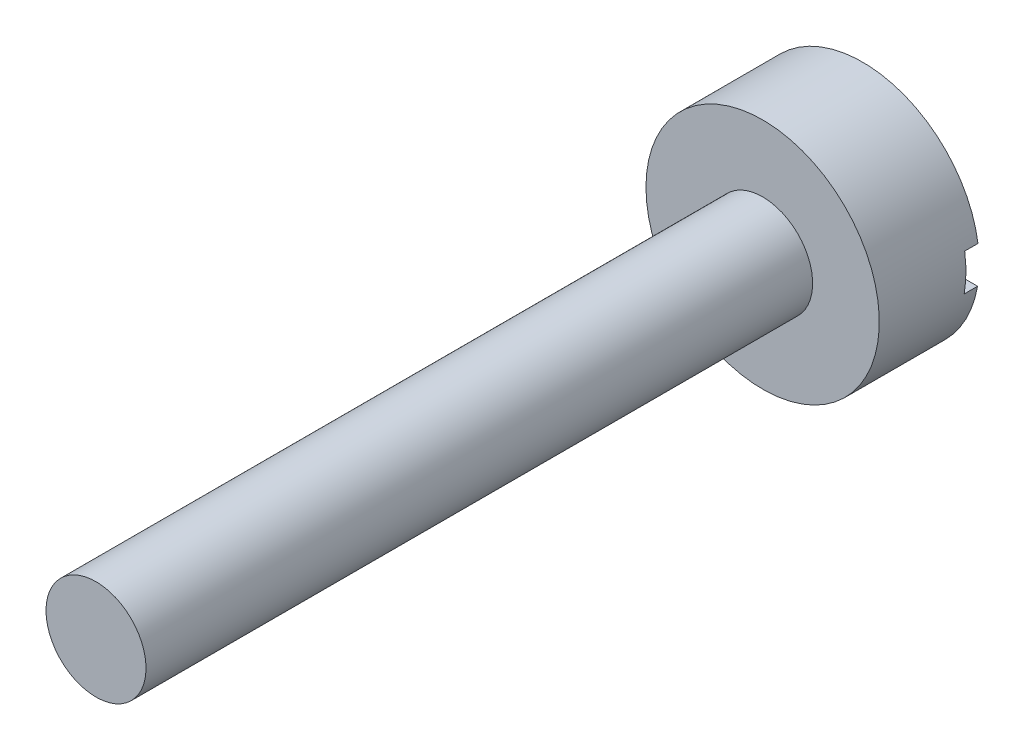
ISO-10303-21;
HEADER;
FILE_DESCRIPTION(('STEP AP214'),'2;1');
FILE_NAME('part.step','',(''),(''),'','','');
FILE_SCHEMA(('AUTOMOTIVE_DESIGN { 1 0 10303 214 1 1 1 1 }'));
ENDSEC;
DATA;
#1=APPLICATION_CONTEXT('core data for automotive mechanical design processes');
#2=APPLICATION_PROTOCOL_DEFINITION('international standard','automotive_design',2000,#1);
#3=PRODUCT_CONTEXT('',#1,'mechanical');
#4=PRODUCT('Part','Part','',(#3));
#5=PRODUCT_RELATED_PRODUCT_CATEGORY('part','',(#4));
#6=PRODUCT_DEFINITION_FORMATION('','',#4);
#7=PRODUCT_DEFINITION_CONTEXT('part definition',#1,'design');
#8=PRODUCT_DEFINITION('design','',#6,#7);
#9=PRODUCT_DEFINITION_SHAPE('','',#8);
#10=(LENGTH_UNIT() NAMED_UNIT(*) SI_UNIT(.MILLI.,.METRE.));
#11=(NAMED_UNIT(*) PLANE_ANGLE_UNIT() SI_UNIT($,.RADIAN.));
#12=(NAMED_UNIT(*) SI_UNIT($,.STERADIAN.) SOLID_ANGLE_UNIT());
#13=UNCERTAINTY_MEASURE_WITH_UNIT(LENGTH_MEASURE(1.E-05),#10,'distance_accuracy_value','');
#14=(GEOMETRIC_REPRESENTATION_CONTEXT(3) GLOBAL_UNCERTAINTY_ASSIGNED_CONTEXT((#13)) GLOBAL_UNIT_ASSIGNED_CONTEXT((#10,
#11,#12)) REPRESENTATION_CONTEXT('',''));
#15=CARTESIAN_POINT('',(0.,0.,0.));
#16=DIRECTION('',(0.,0.,1.));
#17=DIRECTION('',(1.,0.,0.));
#18=AXIS2_PLACEMENT_3D('',#15,#16,#17);
#19=CARTESIAN_POINT('',(4.445,0.,-29.21));
#20=DIRECTION('',(0.,0.,1.));
#21=DIRECTION('',(1.,0.,0.));
#22=AXIS2_PLACEMENT_3D('',#19,#20,#21);
#23=PLANE('',#22);
#24=CARTESIAN_POINT('',(0.,0.,-29.21));
#25=DIRECTION('',(0.,0.,-1.));
#26=DIRECTION('',(-1.,0.,0.));
#27=AXIS2_PLACEMENT_3D('',#24,#25,#26);
#28=CIRCLE('',#27,4.445);
#29=CARTESIAN_POINT('',(4.37919867098993,-0.762,-29.21));
#30=VERTEX_POINT('',#29);
#31=CARTESIAN_POINT('',(-4.37919867098993,-0.762,-29.21));
#32=VERTEX_POINT('',#31);
#33=EDGE_CURVE('E93',#30,#32,#28,.T.);
#34=ORIENTED_EDGE('',*,*,#33,.T.);
#35=DIRECTION('',(1.,0.,0.));
#36=VECTOR('',#35,1.);
#37=CARTESIAN_POINT('',(4.445,-0.762,-29.21));
#38=LINE('',#37,#36);
#39=EDGE_CURVE('E110',#32,#30,#38,.T.);
#40=ORIENTED_EDGE('',*,*,#39,.T.);
#41=EDGE_LOOP('',(#34,#40));
#42=FACE_BOUND('',#41,.T.);
#43=ADVANCED_FACE('F32',(#42),#23,.F.);
#44=CARTESIAN_POINT('',(0.,0.,0.));
#45=DIRECTION('',(0.,0.,-1.));
#46=DIRECTION('',(-1.,0.,0.));
#47=AXIS2_PLACEMENT_3D('',#44,#45,#46);
#48=PLANE('',#47);
#49=CARTESIAN_POINT('',(0.,0.,0.));
#50=DIRECTION('',(0.,0.,-1.));
#51=DIRECTION('',(-1.,0.,0.));
#52=AXIS2_PLACEMENT_3D('',#49,#50,#51);
#53=CIRCLE('',#52,1.905);
#54=CARTESIAN_POINT('',(-1.905,0.,0.));
#55=VERTEX_POINT('',#54);
#56=EDGE_CURVE('E107',#55,#55,#53,.T.);
#57=ORIENTED_EDGE('',*,*,#56,.F.);
#58=EDGE_LOOP('',(#57));
#59=FACE_BOUND('',#58,.T.);
#60=ADVANCED_FACE('F34',(#59),#48,.F.);
#61=CARTESIAN_POINT('',(0.,0.,-29.21));
#62=DIRECTION('',(0.,0.,-1.));
#63=DIRECTION('',(-1.,0.,0.));
#64=AXIS2_PLACEMENT_3D('',#61,#62,#63);
#65=CYLINDRICAL_SURFACE('',#64,1.905);
#66=CARTESIAN_POINT('',(0.,0.,-25.4));
#67=DIRECTION('',(0.,0.,-1.));
#68=DIRECTION('',(-1.,0.,0.));
#69=AXIS2_PLACEMENT_3D('',#66,#67,#68);
#70=CIRCLE('',#69,1.905);
#71=CARTESIAN_POINT('',(-1.905,0.,-25.4));
#72=VERTEX_POINT('',#71);
#73=EDGE_CURVE('E104',#72,#72,#70,.T.);
#74=ORIENTED_EDGE('',*,*,#73,.F.);
#75=EDGE_LOOP('',(#74));
#76=FACE_BOUND('',#75,.T.);
#77=ORIENTED_EDGE('',*,*,#56,.T.);
#78=EDGE_LOOP('',(#77));
#79=FACE_BOUND('',#78,.T.);
#80=ADVANCED_FACE('F128',(#76,#79),#65,.T.);
#81=CARTESIAN_POINT('',(1.905,0.,-25.4));
#82=DIRECTION('',(0.,0.,-1.));
#83=DIRECTION('',(-1.,0.,0.));
#84=AXIS2_PLACEMENT_3D('',#81,#82,#83);
#85=PLANE('',#84);
#86=CARTESIAN_POINT('',(0.,0.,-25.4));
#87=DIRECTION('',(0.,0.,-1.));
#88=DIRECTION('',(-1.,0.,0.));
#89=AXIS2_PLACEMENT_3D('',#86,#87,#88);
#90=CIRCLE('',#89,4.445);
#91=CARTESIAN_POINT('',(-4.445,0.,-25.4));
#92=VERTEX_POINT('',#91);
#93=EDGE_CURVE('E101',#92,#92,#90,.T.);
#94=ORIENTED_EDGE('',*,*,#93,.F.);
#95=EDGE_LOOP('',(#94));
#96=FACE_BOUND('',#95,.T.);
#97=ORIENTED_EDGE('',*,*,#73,.T.);
#98=EDGE_LOOP('',(#97));
#99=FACE_BOUND('',#98,.T.);
#100=ADVANCED_FACE('F136',(#96,#99),#85,.F.);
#101=CARTESIAN_POINT('',(0.,0.,-29.21));
#102=DIRECTION('',(0.,0.,-1.));
#103=DIRECTION('',(-1.,0.,0.));
#104=AXIS2_PLACEMENT_3D('',#101,#102,#103);
#105=CYLINDRICAL_SURFACE('',#104,4.445);
#106=ORIENTED_EDGE('',*,*,#33,.F.);
#107=DIRECTION('',(0.,0.,-1.));
#108=VECTOR('',#107,1.);
#109=CARTESIAN_POINT('',(4.37919867098993,-0.762,-29.21));
#110=LINE('',#109,#108);
#111=CARTESIAN_POINT('',(4.37919867098993,-0.762,-28.702));
#112=VERTEX_POINT('',#111);
#113=EDGE_CURVE('E81',#30,#112,#110,.F.);
#114=ORIENTED_EDGE('',*,*,#113,.T.);
#115=CARTESIAN_POINT('',(0.,0.,-28.702));
#116=DIRECTION('',(0.,0.,1.));
#117=DIRECTION('',(1.,0.,0.));
#118=AXIS2_PLACEMENT_3D('',#115,#116,#117);
#119=CIRCLE('',#118,4.445);
#120=CARTESIAN_POINT('',(4.39606712160731,0.657737685041098,-28.702));
#121=VERTEX_POINT('',#120);
#122=EDGE_CURVE('E11',#112,#121,#119,.T.);
#123=ORIENTED_EDGE('',*,*,#122,.T.);
#124=DIRECTION('',(0.,0.,-1.));
#125=VECTOR('',#124,1.);
#126=CARTESIAN_POINT('',(4.39606712160731,0.657737685041096,-29.21));
#127=LINE('',#126,#125);
#128=CARTESIAN_POINT('',(4.39606712160731,0.657737685041096,-29.21));
#129=VERTEX_POINT('',#128);
#130=EDGE_CURVE('E73',#121,#129,#127,.T.);
#131=ORIENTED_EDGE('',*,*,#130,.T.);
#132=CARTESIAN_POINT('',(-4.39606712160731,0.657737685041096,-29.21));
#133=VERTEX_POINT('',#132);
#134=EDGE_CURVE('E99',#133,#129,#28,.T.);
#135=ORIENTED_EDGE('',*,*,#134,.F.);
#136=DIRECTION('',(0.,0.,-1.));
#137=VECTOR('',#136,1.);
#138=CARTESIAN_POINT('',(-4.39606712160731,0.657737685041096,-29.21));
#139=LINE('',#138,#137);
#140=CARTESIAN_POINT('',(-4.39606712160731,0.657737685041098,-28.702));
#141=VERTEX_POINT('',#140);
#142=EDGE_CURVE('E47',#133,#141,#139,.F.);
#143=ORIENTED_EDGE('',*,*,#142,.T.);
#144=CARTESIAN_POINT('',(-4.37919867098993,-0.762,-28.702));
#145=VERTEX_POINT('',#144);
#146=EDGE_CURVE('E36',#141,#145,#119,.T.);
#147=ORIENTED_EDGE('',*,*,#146,.T.);
#148=DIRECTION('',(0.,0.,-1.));
#149=VECTOR('',#148,1.);
#150=CARTESIAN_POINT('',(-4.37919867098993,-0.762,-29.21));
#151=LINE('',#150,#149);
#152=EDGE_CURVE('E55',#145,#32,#151,.T.);
#153=ORIENTED_EDGE('',*,*,#152,.T.);
#154=EDGE_LOOP('',(#106,#114,#123,#131,#135,#143,#147,#153));
#155=FACE_BOUND('',#154,.T.);
#156=ORIENTED_EDGE('',*,*,#93,.T.);
#157=EDGE_LOOP('',(#156));
#158=FACE_BOUND('',#157,.T.);
#159=ADVANCED_FACE('F90',(#155,#158),#105,.T.);
#160=ORIENTED_EDGE('',*,*,#134,.T.);
#161=DIRECTION('',(-1.,0.,0.));
#162=VECTOR('',#161,1.);
#163=CARTESIAN_POINT('',(4.445,0.657737685041096,-29.21));
#164=LINE('',#163,#162);
#165=EDGE_CURVE('E77',#129,#133,#164,.T.);
#166=ORIENTED_EDGE('',*,*,#165,.T.);
#167=EDGE_LOOP('',(#160,#166));
#168=FACE_BOUND('',#167,.T.);
#169=ADVANCED_FACE('F121',(#168),#23,.F.);
#170=CARTESIAN_POINT('',(127.,-0.762,-28.702));
#171=DIRECTION('',(0.,0.,1.));
#172=DIRECTION('',(1.,0.,0.));
#173=AXIS2_PLACEMENT_3D('',#170,#171,#172);
#174=PLANE('',#173);
#175=DIRECTION('',(-1.,0.,0.));
#176=VECTOR('',#175,1.);
#177=CARTESIAN_POINT('',(127.,0.657737685041098,-28.702));
#178=LINE('',#177,#176);
#179=EDGE_CURVE('E76',#121,#141,#178,.T.);
#180=ORIENTED_EDGE('',*,*,#179,.F.);
#181=ORIENTED_EDGE('',*,*,#122,.F.);
#182=DIRECTION('',(-1.,0.,0.));
#183=VECTOR('',#182,1.);
#184=CARTESIAN_POINT('',(127.,-0.762,-28.702));
#185=LINE('',#184,#183);
#186=EDGE_CURVE('E86',#112,#145,#185,.T.);
#187=ORIENTED_EDGE('',*,*,#186,.T.);
#188=ORIENTED_EDGE('',*,*,#146,.F.);
#189=EDGE_LOOP('',(#180,#181,#187,#188));
#190=FACE_BOUND('',#189,.T.);
#191=ADVANCED_FACE('F84',(#190),#174,.F.);
#192=CARTESIAN_POINT('',(127.,-0.762,-29.21));
#193=DIRECTION('',(0.,-1.,0.));
#194=DIRECTION('',(0.,0.,-1.));
#195=AXIS2_PLACEMENT_3D('',#192,#193,#194);
#196=PLANE('',#195);
#197=ORIENTED_EDGE('',*,*,#186,.F.);
#198=ORIENTED_EDGE('',*,*,#113,.F.);
#199=ORIENTED_EDGE('',*,*,#39,.F.);
#200=ORIENTED_EDGE('',*,*,#152,.F.);
#201=EDGE_LOOP('',(#197,#198,#199,#200));
#202=FACE_BOUND('',#201,.T.);
#203=ADVANCED_FACE('F113',(#202),#196,.F.);
#204=CARTESIAN_POINT('',(127.,0.657737685041098,-28.702));
#205=DIRECTION('',(0.,1.,0.));
#206=DIRECTION('',(0.,0.,1.));
#207=AXIS2_PLACEMENT_3D('',#204,#205,#206);
#208=PLANE('',#207);
#209=ORIENTED_EDGE('',*,*,#179,.T.);
#210=ORIENTED_EDGE('',*,*,#142,.F.);
#211=ORIENTED_EDGE('',*,*,#165,.F.);
#212=ORIENTED_EDGE('',*,*,#130,.F.);
#213=EDGE_LOOP('',(#209,#210,#211,#212));
#214=FACE_BOUND('',#213,.T.);
#215=ADVANCED_FACE('F75',(#214),#208,.F.);
#216=CLOSED_SHELL('',(#43,#60,#80,#100,#159,#169,#191,#203,#215));
#217=MANIFOLD_SOLID_BREP('B2',#216);
#218=ADVANCED_BREP_SHAPE_REPRESENTATION('',(#18,#217),#14);
#219=SHAPE_DEFINITION_REPRESENTATION(#9,#218);
ENDSEC;
END-ISO-10303-21;
